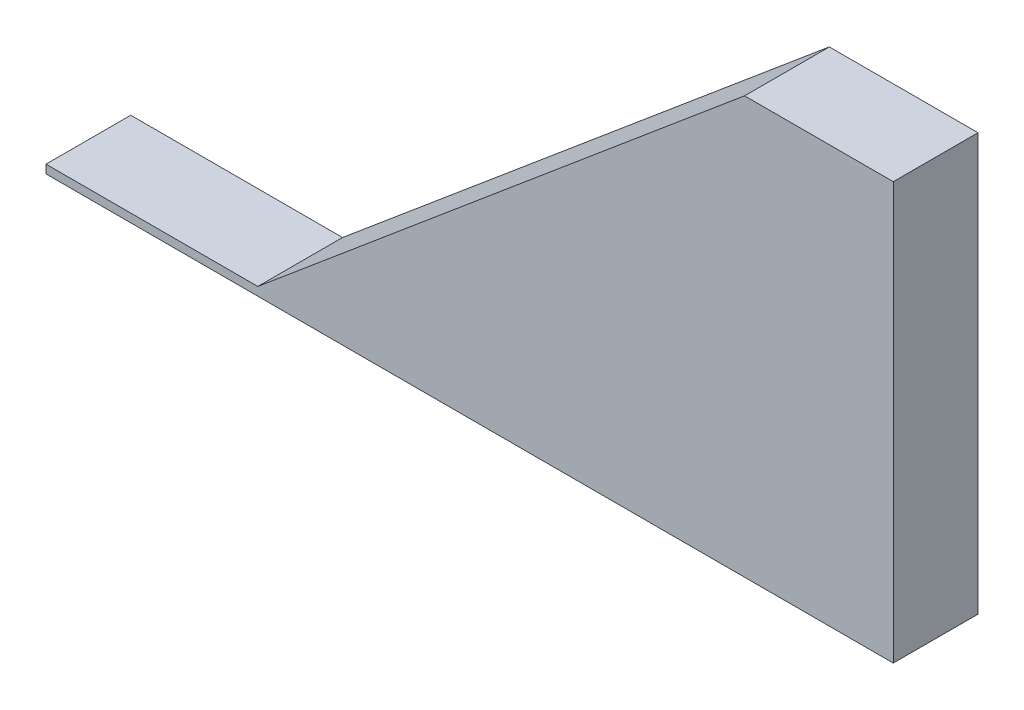
ISO-10303-21;
HEADER;
FILE_DESCRIPTION(('STEP AP214'),'2;1');
FILE_NAME('part.step','',(''),(''),'','','');
FILE_SCHEMA(('AUTOMOTIVE_DESIGN { 1 0 10303 214 1 1 1 1 }'));
ENDSEC;
DATA;
#1=APPLICATION_CONTEXT('core data for automotive mechanical design processes');
#2=APPLICATION_PROTOCOL_DEFINITION('international standard','automotive_design',2000,#1);
#3=PRODUCT_CONTEXT('',#1,'mechanical');
#4=PRODUCT('Part','Part','',(#3));
#5=PRODUCT_RELATED_PRODUCT_CATEGORY('part','',(#4));
#6=PRODUCT_DEFINITION_FORMATION('','',#4);
#7=PRODUCT_DEFINITION_CONTEXT('part definition',#1,'design');
#8=PRODUCT_DEFINITION('design','',#6,#7);
#9=PRODUCT_DEFINITION_SHAPE('','',#8);
#10=(LENGTH_UNIT() NAMED_UNIT(*) SI_UNIT(.MILLI.,.METRE.));
#11=(NAMED_UNIT(*) PLANE_ANGLE_UNIT() SI_UNIT($,.RADIAN.));
#12=(NAMED_UNIT(*) SI_UNIT($,.STERADIAN.) SOLID_ANGLE_UNIT());
#13=UNCERTAINTY_MEASURE_WITH_UNIT(LENGTH_MEASURE(1.E-05),#10,'distance_accuracy_value','');
#14=(GEOMETRIC_REPRESENTATION_CONTEXT(3) GLOBAL_UNCERTAINTY_ASSIGNED_CONTEXT((#13)) GLOBAL_UNIT_ASSIGNED_CONTEXT((#10,
#11,#12)) REPRESENTATION_CONTEXT('',''));
#15=CARTESIAN_POINT('',(0.,0.,0.));
#16=DIRECTION('',(0.,0.,1.));
#17=DIRECTION('',(1.,0.,0.));
#18=AXIS2_PLACEMENT_3D('',#15,#16,#17);
#19=CARTESIAN_POINT('',(1467.37320695732,1160.61411797809,200.));
#20=DIRECTION('',(0.,1.,0.));
#21=DIRECTION('',(0.,0.,1.));
#22=AXIS2_PLACEMENT_3D('',#19,#20,#21);
#23=PLANE('',#22);
#24=DIRECTION('',(1.,0.,0.));
#25=VECTOR('',#24,1.);
#26=CARTESIAN_POINT('',(1467.37320695732,1160.61411797809,0.));
#27=LINE('',#26,#25);
#28=CARTESIAN_POINT('',(1467.37320695732,1160.61411797809,0.));
#29=VERTEX_POINT('',#28);
#30=CARTESIAN_POINT('',(1818.30654227885,1160.61411797809,0.));
#31=VERTEX_POINT('',#30);
#32=EDGE_CURVE('E119',#29,#31,#27,.T.);
#33=ORIENTED_EDGE('',*,*,#32,.F.);
#34=DIRECTION('',(0.,0.,-1.));
#35=VECTOR('',#34,1.);
#36=CARTESIAN_POINT('',(1467.37320695732,1160.61411797809,200.));
#37=LINE('',#36,#35);
#38=CARTESIAN_POINT('',(1467.37320695732,1160.61411797809,200.));
#39=VERTEX_POINT('',#38);
#40=EDGE_CURVE('E11',#39,#29,#37,.T.);
#41=ORIENTED_EDGE('',*,*,#40,.F.);
#42=DIRECTION('',(1.,0.,0.));
#43=VECTOR('',#42,1.);
#44=CARTESIAN_POINT('',(1467.37320695732,1160.61411797809,200.));
#45=LINE('',#44,#43);
#46=CARTESIAN_POINT('',(1818.30654227885,1160.61411797809,200.));
#47=VERTEX_POINT('',#46);
#48=EDGE_CURVE('E131',#39,#47,#45,.T.);
#49=ORIENTED_EDGE('',*,*,#48,.T.);
#50=DIRECTION('',(0.,0.,-1.));
#51=VECTOR('',#50,1.);
#52=CARTESIAN_POINT('',(1818.30654227885,1160.61411797809,200.));
#53=LINE('',#52,#51);
#54=EDGE_CURVE('E38',#47,#31,#53,.T.);
#55=ORIENTED_EDGE('',*,*,#54,.T.);
#56=EDGE_LOOP('',(#33,#41,#49,#55));
#57=FACE_BOUND('',#56,.T.);
#58=ADVANCED_FACE('F35',(#57),#23,.T.);
#59=CARTESIAN_POINT('',(318.306542278852,196.432703448281,200.));
#60=DIRECTION('',(-0.642787609686541,0.766044443118977,0.));
#61=DIRECTION('',(-0.766044443118977,-0.642787609686541,0.));
#62=AXIS2_PLACEMENT_3D('',#59,#60,#61);
#63=PLANE('',#62);
#64=DIRECTION('',(0.766044443118977,0.642787609686541,0.));
#65=VECTOR('',#64,1.);
#66=CARTESIAN_POINT('',(318.306542278852,196.432703448281,0.));
#67=LINE('',#66,#65);
#68=CARTESIAN_POINT('',(318.306542278852,196.432703448281,0.));
#69=VERTEX_POINT('',#68);
#70=EDGE_CURVE('E129',#69,#29,#67,.T.);
#71=ORIENTED_EDGE('',*,*,#70,.F.);
#72=DIRECTION('',(0.,0.,-1.));
#73=VECTOR('',#72,1.);
#74=CARTESIAN_POINT('',(318.306542278852,196.432703448281,200.));
#75=LINE('',#74,#73);
#76=CARTESIAN_POINT('',(318.306542278852,196.432703448281,200.));
#77=VERTEX_POINT('',#76);
#78=EDGE_CURVE('E44',#77,#69,#75,.T.);
#79=ORIENTED_EDGE('',*,*,#78,.F.);
#80=DIRECTION('',(0.766044443118977,0.642787609686541,0.));
#81=VECTOR('',#80,1.);
#82=CARTESIAN_POINT('',(318.306542278852,196.432703448281,200.));
#83=LINE('',#82,#81);
#84=EDGE_CURVE('E108',#77,#39,#83,.T.);
#85=ORIENTED_EDGE('',*,*,#84,.T.);
#86=ORIENTED_EDGE('',*,*,#40,.T.);
#87=EDGE_LOOP('',(#71,#79,#85,#86));
#88=FACE_BOUND('',#87,.T.);
#89=ADVANCED_FACE('F141',(#88),#63,.T.);
#90=CARTESIAN_POINT('',(-181.693457721148,196.432703448281,200.));
#91=DIRECTION('',(0.,1.,0.));
#92=DIRECTION('',(-1.,0.,0.));
#93=AXIS2_PLACEMENT_3D('',#90,#91,#92);
#94=PLANE('',#93);
#95=DIRECTION('',(1.,0.,0.));
#96=VECTOR('',#95,1.);
#97=CARTESIAN_POINT('',(-181.693457721148,196.432703448281,0.));
#98=LINE('',#97,#96);
#99=CARTESIAN_POINT('',(-181.693457721148,196.432703448281,0.));
#100=VERTEX_POINT('',#99);
#101=EDGE_CURVE('E96',#100,#69,#98,.T.);
#102=ORIENTED_EDGE('',*,*,#101,.F.);
#103=DIRECTION('',(0.,0.,-1.));
#104=VECTOR('',#103,1.);
#105=CARTESIAN_POINT('',(-181.693457721148,196.432703448281,200.));
#106=LINE('',#105,#104);
#107=CARTESIAN_POINT('',(-181.693457721148,196.432703448281,200.));
#108=VERTEX_POINT('',#107);
#109=EDGE_CURVE('E91',#108,#100,#106,.T.);
#110=ORIENTED_EDGE('',*,*,#109,.F.);
#111=DIRECTION('',(1.,0.,0.));
#112=VECTOR('',#111,1.);
#113=CARTESIAN_POINT('',(-181.693457721148,196.432703448281,200.));
#114=LINE('',#113,#112);
#115=EDGE_CURVE('E94',#108,#77,#114,.T.);
#116=ORIENTED_EDGE('',*,*,#115,.T.);
#117=ORIENTED_EDGE('',*,*,#78,.T.);
#118=EDGE_LOOP('',(#102,#110,#116,#117));
#119=FACE_BOUND('',#118,.T.);
#120=ADVANCED_FACE('F93',(#119),#94,.T.);
#121=CARTESIAN_POINT('',(-181.693457721148,176.432703448281,200.));
#122=DIRECTION('',(-1.,0.,0.));
#123=DIRECTION('',(0.,-1.,0.));
#124=AXIS2_PLACEMENT_3D('',#121,#122,#123);
#125=PLANE('',#124);
#126=DIRECTION('',(0.,1.,0.));
#127=VECTOR('',#126,1.);
#128=CARTESIAN_POINT('',(-181.693457721148,176.432703448281,0.));
#129=LINE('',#128,#127);
#130=CARTESIAN_POINT('',(-181.693457721148,176.432703448281,0.));
#131=VERTEX_POINT('',#130);
#132=EDGE_CURVE('E126',#131,#100,#129,.T.);
#133=ORIENTED_EDGE('',*,*,#132,.F.);
#134=DIRECTION('',(0.,0.,-1.));
#135=VECTOR('',#134,1.);
#136=CARTESIAN_POINT('',(-181.693457721148,176.432703448281,200.));
#137=LINE('',#136,#135);
#138=CARTESIAN_POINT('',(-181.693457721148,176.432703448281,200.));
#139=VERTEX_POINT('',#138);
#140=EDGE_CURVE('E101',#139,#131,#137,.T.);
#141=ORIENTED_EDGE('',*,*,#140,.F.);
#142=DIRECTION('',(0.,1.,0.));
#143=VECTOR('',#142,1.);
#144=CARTESIAN_POINT('',(-181.693457721148,176.432703448281,200.));
#145=LINE('',#144,#143);
#146=EDGE_CURVE('E107',#139,#108,#145,.T.);
#147=ORIENTED_EDGE('',*,*,#146,.T.);
#148=ORIENTED_EDGE('',*,*,#109,.T.);
#149=EDGE_LOOP('',(#133,#141,#147,#148));
#150=FACE_BOUND('',#149,.T.);
#151=ADVANCED_FACE('F110',(#150),#125,.T.);
#152=CARTESIAN_POINT('',(-181.693457721148,176.432703448281,200.));
#153=DIRECTION('',(0.,1.,0.));
#154=DIRECTION('',(0.,0.,1.));
#155=AXIS2_PLACEMENT_3D('',#152,#153,#154);
#156=PLANE('',#155);
#157=DIRECTION('',(1.,0.,0.));
#158=VECTOR('',#157,1.);
#159=CARTESIAN_POINT('',(-181.693457721148,176.432703448281,0.));
#160=LINE('',#159,#158);
#161=CARTESIAN_POINT('',(1818.30654227885,176.432703448281,0.));
#162=VERTEX_POINT('',#161);
#163=EDGE_CURVE('E124',#131,#162,#160,.T.);
#164=ORIENTED_EDGE('',*,*,#163,.T.);
#165=DIRECTION('',(0.,0.,-1.));
#166=VECTOR('',#165,1.);
#167=CARTESIAN_POINT('',(1818.30654227885,176.432703448281,200.));
#168=LINE('',#167,#166);
#169=CARTESIAN_POINT('',(1818.30654227885,176.432703448281,200.));
#170=VERTEX_POINT('',#169);
#171=EDGE_CURVE('E134',#170,#162,#168,.T.);
#172=ORIENTED_EDGE('',*,*,#171,.F.);
#173=DIRECTION('',(1.,0.,0.));
#174=VECTOR('',#173,1.);
#175=CARTESIAN_POINT('',(-181.693457721148,176.432703448281,200.));
#176=LINE('',#175,#174);
#177=EDGE_CURVE('E112',#139,#170,#176,.T.);
#178=ORIENTED_EDGE('',*,*,#177,.F.);
#179=ORIENTED_EDGE('',*,*,#140,.T.);
#180=EDGE_LOOP('',(#164,#172,#178,#179));
#181=FACE_BOUND('',#180,.T.);
#182=ADVANCED_FACE('F154',(#181),#156,.F.);
#183=CARTESIAN_POINT('',(1818.30654227885,176.432703448281,200.));
#184=DIRECTION('',(-1.,0.,0.));
#185=DIRECTION('',(0.,-1.,0.));
#186=AXIS2_PLACEMENT_3D('',#183,#184,#185);
#187=PLANE('',#186);
#188=DIRECTION('',(0.,1.,0.));
#189=VECTOR('',#188,1.);
#190=CARTESIAN_POINT('',(1818.30654227885,176.432703448281,0.));
#191=LINE('',#190,#189);
#192=EDGE_CURVE('E122',#162,#31,#191,.T.);
#193=ORIENTED_EDGE('',*,*,#192,.T.);
#194=ORIENTED_EDGE('',*,*,#54,.F.);
#195=DIRECTION('',(0.,-1.,0.));
#196=VECTOR('',#195,1.);
#197=CARTESIAN_POINT('',(1818.30654227885,1160.61411797809,200.));
#198=LINE('',#197,#196);
#199=EDGE_CURVE('E114',#47,#170,#198,.T.);
#200=ORIENTED_EDGE('',*,*,#199,.T.);
#201=ORIENTED_EDGE('',*,*,#171,.T.);
#202=EDGE_LOOP('',(#193,#194,#200,#201));
#203=FACE_BOUND('',#202,.T.);
#204=ADVANCED_FACE('F156',(#203),#187,.F.);
#205=CARTESIAN_POINT('',(0.,0.,200.));
#206=DIRECTION('',(0.,0.,-1.));
#207=DIRECTION('',(-1.,0.,0.));
#208=AXIS2_PLACEMENT_3D('',#205,#206,#207);
#209=PLANE('',#208);
#210=ORIENTED_EDGE('',*,*,#48,.F.);
#211=ORIENTED_EDGE('',*,*,#84,.F.);
#212=ORIENTED_EDGE('',*,*,#115,.F.);
#213=ORIENTED_EDGE('',*,*,#146,.F.);
#214=ORIENTED_EDGE('',*,*,#177,.T.);
#215=ORIENTED_EDGE('',*,*,#199,.F.);
#216=EDGE_LOOP('',(#210,#211,#212,#213,#214,#215));
#217=FACE_BOUND('',#216,.T.);
#218=ADVANCED_FACE('F105',(#217),#209,.F.);
#219=CARTESIAN_POINT('',(0.,0.,0.));
#220=DIRECTION('',(0.,0.,-1.));
#221=DIRECTION('',(-1.,0.,0.));
#222=AXIS2_PLACEMENT_3D('',#219,#220,#221);
#223=PLANE('',#222);
#224=ORIENTED_EDGE('',*,*,#32,.T.);
#225=ORIENTED_EDGE('',*,*,#192,.F.);
#226=ORIENTED_EDGE('',*,*,#163,.F.);
#227=ORIENTED_EDGE('',*,*,#132,.T.);
#228=ORIENTED_EDGE('',*,*,#101,.T.);
#229=ORIENTED_EDGE('',*,*,#70,.T.);
#230=EDGE_LOOP('',(#224,#225,#226,#227,#228,#229));
#231=FACE_BOUND('',#230,.T.);
#232=ADVANCED_FACE('F139',(#231),#223,.T.);
#233=CLOSED_SHELL('',(#58,#89,#120,#151,#182,#204,#218,#232));
#234=MANIFOLD_SOLID_BREP('B2',#233);
#235=ADVANCED_BREP_SHAPE_REPRESENTATION('',(#18,#234),#14);
#236=SHAPE_DEFINITION_REPRESENTATION(#9,#235);
ENDSEC;
END-ISO-10303-21;
